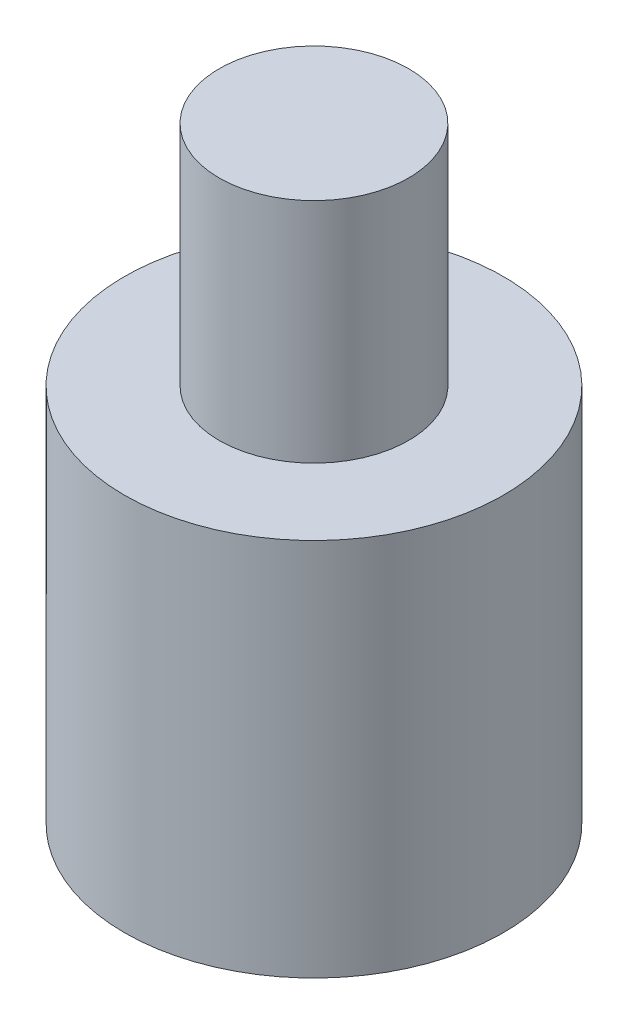
ISO-10303-21;
HEADER;
FILE_DESCRIPTION(('STEP AP214'),'2;1');
FILE_NAME('part.step','',(''),(''),'','','');
FILE_SCHEMA(('AUTOMOTIVE_DESIGN { 1 0 10303 214 1 1 1 1 }'));
ENDSEC;
DATA;
#1=APPLICATION_CONTEXT('core data for automotive mechanical design processes');
#2=APPLICATION_PROTOCOL_DEFINITION('international standard','automotive_design',2000,#1);
#3=PRODUCT_CONTEXT('',#1,'mechanical');
#4=PRODUCT('Part','Part','',(#3));
#5=PRODUCT_RELATED_PRODUCT_CATEGORY('part','',(#4));
#6=PRODUCT_DEFINITION_FORMATION('','',#4);
#7=PRODUCT_DEFINITION_CONTEXT('part definition',#1,'design');
#8=PRODUCT_DEFINITION('design','',#6,#7);
#9=PRODUCT_DEFINITION_SHAPE('','',#8);
#10=(LENGTH_UNIT() NAMED_UNIT(*) SI_UNIT(.MILLI.,.METRE.));
#11=(NAMED_UNIT(*) PLANE_ANGLE_UNIT() SI_UNIT($,.RADIAN.));
#12=(NAMED_UNIT(*) SI_UNIT($,.STERADIAN.) SOLID_ANGLE_UNIT());
#13=UNCERTAINTY_MEASURE_WITH_UNIT(LENGTH_MEASURE(1.E-05),#10,'distance_accuracy_value','');
#14=(GEOMETRIC_REPRESENTATION_CONTEXT(3) GLOBAL_UNCERTAINTY_ASSIGNED_CONTEXT((#13)) GLOBAL_UNIT_ASSIGNED_CONTEXT((#10,
#11,#12)) REPRESENTATION_CONTEXT('',''));
#15=CARTESIAN_POINT('',(0.,0.,0.));
#16=DIRECTION('',(0.,0.,1.));
#17=DIRECTION('',(1.,0.,0.));
#18=AXIS2_PLACEMENT_3D('',#15,#16,#17);
#19=CARTESIAN_POINT('',(0.,5.,0.));
#20=DIRECTION('',(0.,-1.,0.));
#21=DIRECTION('',(0.,0.,-1.));
#22=AXIS2_PLACEMENT_3D('',#19,#20,#21);
#23=CYLINDRICAL_SURFACE('',#22,2.5);
#24=CARTESIAN_POINT('',(0.,5.,0.));
#25=DIRECTION('',(0.,1.,0.));
#26=DIRECTION('',(0.,0.,1.));
#27=AXIS2_PLACEMENT_3D('',#24,#25,#26);
#28=CIRCLE('',#27,2.5);
#29=CARTESIAN_POINT('',(0.,5.,2.5));
#30=VERTEX_POINT('',#29);
#31=EDGE_CURVE('E45',#30,#30,#28,.T.);
#32=ORIENTED_EDGE('',*,*,#31,.F.);
#33=EDGE_LOOP('',(#32));
#34=FACE_BOUND('',#33,.T.);
#35=CARTESIAN_POINT('',(0.,0.,0.));
#36=DIRECTION('',(0.,1.,0.));
#37=DIRECTION('',(0.,0.,1.));
#38=AXIS2_PLACEMENT_3D('',#35,#36,#37);
#39=CIRCLE('',#38,2.5);
#40=CARTESIAN_POINT('',(0.,0.,2.5));
#41=VERTEX_POINT('',#40);
#42=EDGE_CURVE('E40',#41,#41,#39,.T.);
#43=ORIENTED_EDGE('',*,*,#42,.T.);
#44=EDGE_LOOP('',(#43));
#45=FACE_BOUND('',#44,.T.);
#46=ADVANCED_FACE('F37',(#34,#45),#23,.T.);
#47=CARTESIAN_POINT('',(0.,5.,0.));
#48=DIRECTION('',(0.,1.,0.));
#49=DIRECTION('',(0.,0.,1.));
#50=AXIS2_PLACEMENT_3D('',#47,#48,#49);
#51=PLANE('',#50);
#52=CARTESIAN_POINT('',(0.,5.,0.));
#53=DIRECTION('',(0.,1.,0.));
#54=DIRECTION('',(0.,0.,1.));
#55=AXIS2_PLACEMENT_3D('',#52,#53,#54);
#56=CIRCLE('',#55,1.25);
#57=CARTESIAN_POINT('',(0.,5.,1.25));
#58=VERTEX_POINT('',#57);
#59=EDGE_CURVE('E10',#58,#58,#56,.T.);
#60=ORIENTED_EDGE('',*,*,#59,.F.);
#61=EDGE_LOOP('',(#60));
#62=FACE_BOUND('',#61,.T.);
#63=ORIENTED_EDGE('',*,*,#31,.T.);
#64=EDGE_LOOP('',(#63));
#65=FACE_BOUND('',#64,.T.);
#66=ADVANCED_FACE('F65',(#62,#65),#51,.T.);
#67=CARTESIAN_POINT('',(0.,0.,0.));
#68=DIRECTION('',(0.,1.,0.));
#69=DIRECTION('',(0.,0.,1.));
#70=AXIS2_PLACEMENT_3D('',#67,#68,#69);
#71=PLANE('',#70);
#72=ORIENTED_EDGE('',*,*,#42,.F.);
#73=EDGE_LOOP('',(#72));
#74=FACE_BOUND('',#73,.T.);
#75=ADVANCED_FACE('F62',(#74),#71,.F.);
#76=CARTESIAN_POINT('',(0.,8.,0.));
#77=DIRECTION('',(0.,-1.,0.));
#78=DIRECTION('',(0.,0.,-1.));
#79=AXIS2_PLACEMENT_3D('',#76,#77,#78);
#80=CYLINDRICAL_SURFACE('',#79,1.25);
#81=CARTESIAN_POINT('',(0.,8.,0.));
#82=DIRECTION('',(0.,1.,0.));
#83=DIRECTION('',(0.,0.,1.));
#84=AXIS2_PLACEMENT_3D('',#81,#82,#83);
#85=CIRCLE('',#84,1.25);
#86=CARTESIAN_POINT('',(0.,8.,1.25));
#87=VERTEX_POINT('',#86);
#88=EDGE_CURVE('E52',#87,#87,#85,.T.);
#89=ORIENTED_EDGE('',*,*,#88,.F.);
#90=EDGE_LOOP('',(#89));
#91=FACE_BOUND('',#90,.T.);
#92=ORIENTED_EDGE('',*,*,#59,.T.);
#93=EDGE_LOOP('',(#92));
#94=FACE_BOUND('',#93,.T.);
#95=ADVANCED_FACE('F64',(#91,#94),#80,.T.);
#96=CARTESIAN_POINT('',(0.,8.,0.));
#97=DIRECTION('',(0.,1.,0.));
#98=DIRECTION('',(0.,0.,1.));
#99=AXIS2_PLACEMENT_3D('',#96,#97,#98);
#100=PLANE('',#99);
#101=ORIENTED_EDGE('',*,*,#88,.T.);
#102=EDGE_LOOP('',(#101));
#103=FACE_BOUND('',#102,.T.);
#104=ADVANCED_FACE('F70',(#103),#100,.T.);
#105=CLOSED_SHELL('',(#46,#66,#75,#95,#104));
#106=MANIFOLD_SOLID_BREP('B2',#105);
#107=ADVANCED_BREP_SHAPE_REPRESENTATION('',(#18,#106),#14);
#108=SHAPE_DEFINITION_REPRESENTATION(#9,#107);
ENDSEC;
END-ISO-10303-21;
